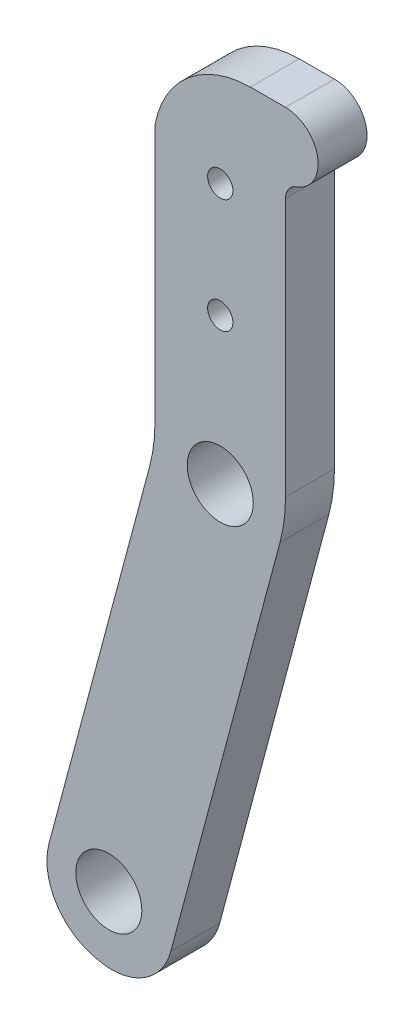
ISO-10303-21;
HEADER;
FILE_DESCRIPTION(('STEP AP214'),'2;1');
FILE_NAME('part.step','',(''),(''),'','','');
FILE_SCHEMA(('AUTOMOTIVE_DESIGN { 1 0 10303 214 1 1 1 1 }'));
ENDSEC;
DATA;
#1=APPLICATION_CONTEXT('core data for automotive mechanical design processes');
#2=APPLICATION_PROTOCOL_DEFINITION('international standard','automotive_design',2000,#1);
#3=PRODUCT_CONTEXT('',#1,'mechanical');
#4=PRODUCT('Part','Part','',(#3));
#5=PRODUCT_RELATED_PRODUCT_CATEGORY('part','',(#4));
#6=PRODUCT_DEFINITION_FORMATION('','',#4);
#7=PRODUCT_DEFINITION_CONTEXT('part definition',#1,'design');
#8=PRODUCT_DEFINITION('design','',#6,#7);
#9=PRODUCT_DEFINITION_SHAPE('','',#8);
#10=(LENGTH_UNIT() NAMED_UNIT(*) SI_UNIT(.MILLI.,.METRE.));
#11=(NAMED_UNIT(*) PLANE_ANGLE_UNIT() SI_UNIT($,.RADIAN.));
#12=(NAMED_UNIT(*) SI_UNIT($,.STERADIAN.) SOLID_ANGLE_UNIT());
#13=UNCERTAINTY_MEASURE_WITH_UNIT(LENGTH_MEASURE(1.E-05),#10,'distance_accuracy_value','');
#14=(GEOMETRIC_REPRESENTATION_CONTEXT(3) GLOBAL_UNCERTAINTY_ASSIGNED_CONTEXT((#13)) GLOBAL_UNIT_ASSIGNED_CONTEXT((#10,
#11,#12)) REPRESENTATION_CONTEXT('',''));
#15=CARTESIAN_POINT('',(0.,0.,0.));
#16=DIRECTION('',(0.,0.,1.));
#17=DIRECTION('',(1.,0.,0.));
#18=AXIS2_PLACEMENT_3D('',#15,#16,#17);
#19=CARTESIAN_POINT('',(167.434880274016,-20.2827594314005,6.));
#20=DIRECTION('',(0.258064516129032,0.966127685927222,0.));
#21=DIRECTION('',(-0.966127685927222,0.258064516129032,0.));
#22=AXIS2_PLACEMENT_3D('',#19,#20,#21);
#23=PLANE('',#22);
#24=DIRECTION('',(0.,0.,1.));
#25=VECTOR('',#24,1.);
#26=CARTESIAN_POINT('',(160.188922629561,-18.3472755604328,0.));
#27=LINE('',#26,#25);
#28=CARTESIAN_POINT('',(160.188922629561,-18.3472755604328,0.));
#29=VERTEX_POINT('',#28);
#30=CARTESIAN_POINT('',(160.188922629561,-18.3472755604328,6.));
#31=VERTEX_POINT('',#30);
#32=EDGE_CURVE('E52',#29,#31,#27,.T.);
#33=ORIENTED_EDGE('',*,*,#32,.T.);
#34=DIRECTION('',(0.966127685927222,-0.258064516129032,0.));
#35=VECTOR('',#34,1.);
#36=CARTESIAN_POINT('',(167.434880274016,-20.2827594314005,6.));
#37=LINE('',#36,#35);
#38=CARTESIAN_POINT('',(159.746394630228,-18.2290709217655,6.));
#39=VERTEX_POINT('',#38);
#40=EDGE_CURVE('E226',#39,#31,#37,.T.);
#41=ORIENTED_EDGE('',*,*,#40,.F.);
#42=DIRECTION('',(0.,0.,1.));
#43=VECTOR('',#42,1.);
#44=CARTESIAN_POINT('',(159.746394630228,-18.2290709217655,0.));
#45=LINE('',#44,#43);
#46=CARTESIAN_POINT('',(159.746394630228,-18.2290709217655,0.));
#47=VERTEX_POINT('',#46);
#48=EDGE_CURVE('E249',#47,#39,#45,.T.);
#49=ORIENTED_EDGE('',*,*,#48,.F.);
#50=DIRECTION('',(0.966127685927222,-0.258064516129032,0.));
#51=VECTOR('',#50,1.);
#52=CARTESIAN_POINT('',(167.434880274016,-20.2827594314005,0.));
#53=LINE('',#52,#51);
#54=EDGE_CURVE('E154',#47,#29,#53,.T.);
#55=ORIENTED_EDGE('',*,*,#54,.T.);
#56=EDGE_LOOP('',(#33,#41,#49,#55));
#57=FACE_BOUND('',#56,.T.);
#58=ADVANCED_FACE('F35',(#57),#23,.F.);
#59=CARTESIAN_POINT('',(166.75743399256,37.0809711141468,6.));
#60=DIRECTION('',(0.966127685927222,-0.258064516129032,0.));
#61=DIRECTION('',(0.258064516129032,0.966127685927222,0.));
#62=AXIS2_PLACEMENT_3D('',#59,#60,#61);
#63=PLANE('',#62);
#64=DIRECTION('',(0.,0.,1.));
#65=VECTOR('',#64,1.);
#66=CARTESIAN_POINT('',(154.435920856742,-9.04762940634365,0.));
#67=LINE('',#66,#65);
#68=CARTESIAN_POINT('',(154.435920856742,-9.04762940634366,0.));
#69=VERTEX_POINT('',#68);
#70=CARTESIAN_POINT('',(154.435920856742,-9.04762940634365,6.));
#71=VERTEX_POINT('',#70);
#72=EDGE_CURVE('E60',#69,#71,#67,.T.);
#73=ORIENTED_EDGE('',*,*,#72,.T.);
#74=DIRECTION('',(-0.258064516129032,-0.966127685927222,0.));
#75=VECTOR('',#74,1.);
#76=CARTESIAN_POINT('',(166.75743399256,37.0809711141468,6.));
#77=LINE('',#76,#75);
#78=CARTESIAN_POINT('',(166.75743399256,37.0809711141468,6.));
#79=VERTEX_POINT('',#78);
#80=EDGE_CURVE('E223',#79,#71,#77,.T.);
#81=ORIENTED_EDGE('',*,*,#80,.F.);
#82=DIRECTION('',(0.,0.,-1.));
#83=VECTOR('',#82,1.);
#84=CARTESIAN_POINT('',(166.75743399256,37.0809711141468,6.));
#85=LINE('',#84,#83);
#86=CARTESIAN_POINT('',(166.75743399256,37.0809711141468,0.));
#87=VERTEX_POINT('',#86);
#88=EDGE_CURVE('E11',#79,#87,#85,.T.);
#89=ORIENTED_EDGE('',*,*,#88,.T.);
#90=DIRECTION('',(-0.258064516129032,-0.966127685927222,0.));
#91=VECTOR('',#90,1.);
#92=CARTESIAN_POINT('',(166.75743399256,37.0809711141468,0.));
#93=LINE('',#92,#91);
#94=EDGE_CURVE('E158',#87,#69,#93,.T.);
#95=ORIENTED_EDGE('',*,*,#94,.T.);
#96=EDGE_LOOP('',(#73,#81,#89,#95));
#97=FACE_BOUND('',#96,.T.);
#98=ADVANCED_FACE('F242',(#97),#63,.F.);
#99=CARTESIAN_POINT('',(183.434880274016,83.6171570961765,6.));
#100=DIRECTION('',(-1.,0.,0.));
#101=DIRECTION('',(0.,0.,1.));
#102=AXIS2_PLACEMENT_3D('',#99,#100,#101);
#103=PLANE('',#102);
#104=DIRECTION('',(0.,0.,1.));
#105=VECTOR('',#104,1.);
#106=CARTESIAN_POINT('',(183.434880274015,73.9603028466835,0.));
#107=LINE('',#106,#105);
#108=CARTESIAN_POINT('',(183.434880274015,73.9603028466835,0.));
#109=VERTEX_POINT('',#108);
#110=CARTESIAN_POINT('',(183.434880274015,73.9603028466835,6.));
#111=VERTEX_POINT('',#110);
#112=EDGE_CURVE('E258',#109,#111,#107,.T.);
#113=ORIENTED_EDGE('',*,*,#112,.T.);
#114=DIRECTION('',(0.,1.,0.));
#115=VECTOR('',#114,1.);
#116=CARTESIAN_POINT('',(183.434880274016,83.6171570961765,6.));
#117=LINE('',#116,#115);
#118=CARTESIAN_POINT('',(183.434880274016,42.2422614367276,6.));
#119=VERTEX_POINT('',#118);
#120=EDGE_CURVE('E232',#119,#111,#117,.T.);
#121=ORIENTED_EDGE('',*,*,#120,.F.);
#122=DIRECTION('',(0.,0.,-1.));
#123=VECTOR('',#122,1.);
#124=CARTESIAN_POINT('',(183.434880274016,42.2422614367276,6.));
#125=LINE('',#124,#123);
#126=CARTESIAN_POINT('',(183.434880274016,42.2422614367276,0.));
#127=VERTEX_POINT('',#126);
#128=EDGE_CURVE('E177',#119,#127,#125,.T.);
#129=ORIENTED_EDGE('',*,*,#128,.T.);
#130=DIRECTION('',(0.,1.,0.));
#131=VECTOR('',#130,1.);
#132=CARTESIAN_POINT('',(183.434880274016,83.6171570961765,0.));
#133=LINE('',#132,#131);
#134=EDGE_CURVE('E156',#127,#109,#133,.T.);
#135=ORIENTED_EDGE('',*,*,#134,.T.);
#136=EDGE_LOOP('',(#113,#121,#129,#135));
#137=FACE_BOUND('',#136,.T.);
#138=ADVANCED_FACE('F265',(#137),#103,.F.);
#139=CARTESIAN_POINT('',(147.434880274016,42.2422614367275,6.));
#140=DIRECTION('',(0.,0.,-1.));
#141=DIRECTION('',(-1.,0.,0.));
#142=AXIS2_PLACEMENT_3D('',#139,#140,#141);
#143=CYLINDRICAL_SURFACE('',#142,20.);
#144=CARTESIAN_POINT('',(147.434880274016,42.2422614367275,0.));
#145=DIRECTION('',(0.,0.,-1.));
#146=DIRECTION('',(1.,0.,0.));
#147=AXIS2_PLACEMENT_3D('',#144,#145,#146);
#148=CIRCLE('',#147,20.);
#149=CARTESIAN_POINT('',(167.434880274016,42.2422614367276,0.));
#150=VERTEX_POINT('',#149);
#151=EDGE_CURVE('E218',#150,#87,#148,.T.);
#152=ORIENTED_EDGE('',*,*,#151,.T.);
#153=ORIENTED_EDGE('',*,*,#88,.F.);
#154=CARTESIAN_POINT('',(147.434880274016,42.2422614367275,6.));
#155=DIRECTION('',(0.,0.,-1.));
#156=DIRECTION('',(1.,0.,0.));
#157=AXIS2_PLACEMENT_3D('',#154,#155,#156);
#158=CIRCLE('',#157,20.);
#159=CARTESIAN_POINT('',(167.434880274016,42.2422614367276,6.));
#160=VERTEX_POINT('',#159);
#161=EDGE_CURVE('E169',#160,#79,#158,.T.);
#162=ORIENTED_EDGE('',*,*,#161,.F.);
#163=DIRECTION('',(0.,0.,-1.));
#164=VECTOR('',#163,1.);
#165=CARTESIAN_POINT('',(167.434880274016,42.2422614367276,6.));
#166=LINE('',#165,#164);
#167=EDGE_CURVE('E170',#160,#150,#166,.T.);
#168=ORIENTED_EDGE('',*,*,#167,.T.);
#169=EDGE_LOOP('',(#152,#153,#162,#168));
#170=FACE_BOUND('',#169,.T.);
#171=ADVANCED_FACE('F37',(#170),#143,.F.);
#172=CARTESIAN_POINT('',(182.75743399256,37.0809711141468,6.));
#173=DIRECTION('',(-0.966127685927222,0.258064516129032,0.));
#174=DIRECTION('',(-0.258064516129032,-0.966127685927222,0.));
#175=AXIS2_PLACEMENT_3D('',#172,#173,#174);
#176=PLANE('',#175);
#177=DIRECTION('',(0.258064516129032,0.966127685927222,0.));
#178=VECTOR('',#177,1.);
#179=CARTESIAN_POINT('',(182.75743399256,37.0809711141468,6.));
#180=LINE('',#179,#178);
#181=CARTESIAN_POINT('',(169.370364144983,-13.0368017869464,6.));
#182=VERTEX_POINT('',#181);
#183=CARTESIAN_POINT('',(182.75743399256,37.0809711141468,6.));
#184=VERTEX_POINT('',#183);
#185=EDGE_CURVE('E146',#182,#184,#180,.T.);
#186=ORIENTED_EDGE('',*,*,#185,.F.);
#187=DIRECTION('',(0.,0.,1.));
#188=VECTOR('',#187,1.);
#189=CARTESIAN_POINT('',(169.370364144983,-13.0368017869464,0.));
#190=LINE('',#189,#188);
#191=CARTESIAN_POINT('',(169.370364144983,-13.0368017869464,0.));
#192=VERTEX_POINT('',#191);
#193=EDGE_CURVE('E132',#192,#182,#190,.T.);
#194=ORIENTED_EDGE('',*,*,#193,.F.);
#195=DIRECTION('',(0.258064516129032,0.966127685927222,0.));
#196=VECTOR('',#195,1.);
#197=CARTESIAN_POINT('',(182.75743399256,37.0809711141468,0.));
#198=LINE('',#197,#196);
#199=CARTESIAN_POINT('',(182.75743399256,37.0809711141468,0.));
#200=VERTEX_POINT('',#199);
#201=EDGE_CURVE('E144',#192,#200,#198,.T.);
#202=ORIENTED_EDGE('',*,*,#201,.T.);
#203=DIRECTION('',(0.,0.,-1.));
#204=VECTOR('',#203,1.);
#205=CARTESIAN_POINT('',(182.75743399256,37.0809711141468,6.));
#206=LINE('',#205,#204);
#207=EDGE_CURVE('E44',#184,#200,#206,.T.);
#208=ORIENTED_EDGE('',*,*,#207,.F.);
#209=EDGE_LOOP('',(#186,#194,#202,#208));
#210=FACE_BOUND('',#209,.T.);
#211=ADVANCED_FACE('F142',(#210),#176,.F.);
#212=CARTESIAN_POINT('',(163.434880274016,42.2422614367275,6.));
#213=DIRECTION('',(0.,0.,-1.));
#214=DIRECTION('',(-1.,0.,0.));
#215=AXIS2_PLACEMENT_3D('',#212,#213,#214);
#216=CYLINDRICAL_SURFACE('',#215,20.);
#217=CARTESIAN_POINT('',(163.434880274016,42.2422614367275,0.));
#218=DIRECTION('',(0.,0.,1.));
#219=DIRECTION('',(-1.,0.,0.));
#220=AXIS2_PLACEMENT_3D('',#217,#218,#219);
#221=CIRCLE('',#220,20.);
#222=EDGE_CURVE('E153',#200,#127,#221,.T.);
#223=ORIENTED_EDGE('',*,*,#222,.T.);
#224=ORIENTED_EDGE('',*,*,#128,.F.);
#225=CARTESIAN_POINT('',(163.434880274016,42.2422614367275,6.));
#226=DIRECTION('',(0.,0.,1.));
#227=DIRECTION('',(-1.,0.,0.));
#228=AXIS2_PLACEMENT_3D('',#225,#226,#227);
#229=CIRCLE('',#228,20.);
#230=EDGE_CURVE('E230',#184,#119,#229,.T.);
#231=ORIENTED_EDGE('',*,*,#230,.F.);
#232=ORIENTED_EDGE('',*,*,#207,.T.);
#233=EDGE_LOOP('',(#223,#224,#231,#232));
#234=FACE_BOUND('',#233,.T.);
#235=ADVANCED_FACE('F274',(#234),#216,.T.);
#236=CARTESIAN_POINT('',(183.434880274016,83.6171570961765,6.));
#237=DIRECTION('',(0.,-1.,0.));
#238=DIRECTION('',(0.,0.,-1.));
#239=AXIS2_PLACEMENT_3D('',#236,#237,#238);
#240=PLANE('',#239);
#241=DIRECTION('',(-1.,0.,0.));
#242=VECTOR('',#241,1.);
#243=CARTESIAN_POINT('',(183.434880274016,83.6171570961765,0.));
#244=LINE('',#243,#242);
#245=CARTESIAN_POINT('',(183.434880274016,83.6171570961765,0.));
#246=VERTEX_POINT('',#245);
#247=CARTESIAN_POINT('',(179.126801066159,83.6171570961765,0.));
#248=VERTEX_POINT('',#247);
#249=EDGE_CURVE('E164',#246,#248,#244,.T.);
#250=ORIENTED_EDGE('',*,*,#249,.T.);
#251=DIRECTION('',(0.,0.,1.));
#252=VECTOR('',#251,1.);
#253=CARTESIAN_POINT('',(179.126801066159,83.6171570961765,0.));
#254=LINE('',#253,#252);
#255=CARTESIAN_POINT('',(179.126801066159,83.6171570961765,6.));
#256=VERTEX_POINT('',#255);
#257=EDGE_CURVE('E202',#248,#256,#254,.T.);
#258=ORIENTED_EDGE('',*,*,#257,.T.);
#259=DIRECTION('',(-1.,0.,0.));
#260=VECTOR('',#259,1.);
#261=CARTESIAN_POINT('',(183.434880274016,83.6171570961765,6.));
#262=LINE('',#261,#260);
#263=CARTESIAN_POINT('',(183.434880274016,83.6171570961765,6.));
#264=VERTEX_POINT('',#263);
#265=EDGE_CURVE('E235',#264,#256,#262,.T.);
#266=ORIENTED_EDGE('',*,*,#265,.F.);
#267=DIRECTION('',(0.,0.,-1.));
#268=VECTOR('',#267,1.);
#269=CARTESIAN_POINT('',(183.434880274016,83.6171570961765,6.));
#270=LINE('',#269,#268);
#271=EDGE_CURVE('E173',#264,#246,#270,.T.);
#272=ORIENTED_EDGE('',*,*,#271,.T.);
#273=EDGE_LOOP('',(#250,#258,#266,#272));
#274=FACE_BOUND('',#273,.T.);
#275=ADVANCED_FACE('F287',(#274),#240,.F.);
#276=CARTESIAN_POINT('',(167.434880274016,83.6171570961765,6.));
#277=DIRECTION('',(1.,0.,0.));
#278=DIRECTION('',(0.,0.,-1.));
#279=AXIS2_PLACEMENT_3D('',#276,#277,#278);
#280=PLANE('',#279);
#281=DIRECTION('',(0.,-1.,0.));
#282=VECTOR('',#281,1.);
#283=CARTESIAN_POINT('',(167.434880274016,83.6171570961765,6.));
#284=LINE('',#283,#282);
#285=CARTESIAN_POINT('',(167.434880274016,73.7778891471937,6.));
#286=VERTEX_POINT('',#285);
#287=EDGE_CURVE('E174',#286,#160,#284,.T.);
#288=ORIENTED_EDGE('',*,*,#287,.F.);
#289=DIRECTION('',(0.,0.,1.));
#290=VECTOR('',#289,1.);
#291=CARTESIAN_POINT('',(167.434880274016,73.7778891471937,0.));
#292=LINE('',#291,#290);
#293=CARTESIAN_POINT('',(167.434880274016,73.7778891471937,0.));
#294=VERTEX_POINT('',#293);
#295=EDGE_CURVE('E204',#294,#286,#292,.T.);
#296=ORIENTED_EDGE('',*,*,#295,.F.);
#297=DIRECTION('',(0.,-1.,0.));
#298=VECTOR('',#297,1.);
#299=CARTESIAN_POINT('',(167.434880274016,83.6171570961765,0.));
#300=LINE('',#299,#298);
#301=EDGE_CURVE('E167',#294,#150,#300,.T.);
#302=ORIENTED_EDGE('',*,*,#301,.T.);
#303=ORIENTED_EDGE('',*,*,#167,.F.);
#304=EDGE_LOOP('',(#288,#296,#302,#303));
#305=FACE_BOUND('',#304,.T.);
#306=ADVANCED_FACE('F293',(#305),#280,.F.);
#307=CARTESIAN_POINT('',(147.434880274016,42.2422614367275,6.));
#308=DIRECTION('',(0.,0.,1.));
#309=DIRECTION('',(1.,0.,0.));
#310=AXIS2_PLACEMENT_3D('',#307,#308,#309);
#311=PLANE('',#310);
#312=CARTESIAN_POINT('',(162.124406500529,-11.1013179159786,6.));
#313=DIRECTION('',(0.,0.,-1.));
#314=DIRECTION('',(1.,0.,0.));
#315=AXIS2_PLACEMENT_3D('',#312,#313,#314);
#316=CIRCLE('',#315,7.5);
#317=EDGE_CURVE('E138',#182,#31,#316,.T.);
#318=ORIENTED_EDGE('',*,*,#317,.F.);
#319=ORIENTED_EDGE('',*,*,#185,.T.);
#320=ORIENTED_EDGE('',*,*,#230,.T.);
#321=ORIENTED_EDGE('',*,*,#120,.T.);
#322=CARTESIAN_POINT('',(185.434880274016,73.9603028466822,6.));
#323=DIRECTION('',(0.,0.,-1.));
#324=DIRECTION('',(-1.,0.,0.));
#325=AXIS2_PLACEMENT_3D('',#322,#323,#324);
#326=CIRCLE('',#325,2.00000000000059);
#327=CARTESIAN_POINT('',(184.768213607347,75.8459209298475,6.));
#328=VERTEX_POINT('',#327);
#329=EDGE_CURVE('E254',#111,#328,#326,.T.);
#330=ORIENTED_EDGE('',*,*,#329,.T.);
#331=CARTESIAN_POINT('',(183.434880274016,79.6171570961765,6.));
#332=DIRECTION('',(0.,0.,1.));
#333=DIRECTION('',(1.,0.,0.));
#334=AXIS2_PLACEMENT_3D('',#331,#332,#333);
#335=CIRCLE('',#334,4.);
#336=EDGE_CURVE('E182',#328,#264,#335,.T.);
#337=ORIENTED_EDGE('',*,*,#336,.T.);
#338=ORIENTED_EDGE('',*,*,#265,.T.);
#339=CARTESIAN_POINT('',(179.238841350269,71.6176801502951,6.));
#340=DIRECTION('',(0.,0.,-1.));
#341=DIRECTION('',(1.,0.,0.));
#342=AXIS2_PLACEMENT_3D('',#339,#340,#341);
#343=CIRCLE('',#342,12.);
#344=EDGE_CURVE('E197',#286,#256,#343,.T.);
#345=ORIENTED_EDGE('',*,*,#344,.F.);
#346=ORIENTED_EDGE('',*,*,#287,.T.);
#347=ORIENTED_EDGE('',*,*,#161,.T.);
#348=ORIENTED_EDGE('',*,*,#80,.T.);
#349=CARTESIAN_POINT('',(161.681878501196,-10.9831132773114,6.));
#350=DIRECTION('',(0.,0.,-1.));
#351=DIRECTION('',(1.,0.,0.));
#352=AXIS2_PLACEMENT_3D('',#349,#350,#351);
#353=CIRCLE('',#352,7.5);
#354=EDGE_CURVE('E147',#39,#71,#353,.T.);
#355=ORIENTED_EDGE('',*,*,#354,.F.);
#356=ORIENTED_EDGE('',*,*,#40,.T.);
#357=EDGE_LOOP('',(#318,#319,#320,#321,#330,#337,#338,#345,#346,#347,#348,#355,#356));
#358=FACE_BOUND('',#357,.T.);
#359=CARTESIAN_POINT('',(175.434880274009,71.5307705710504,6.));
#360=DIRECTION('',(0.,0.,1.));
#361=DIRECTION('',(1.,0.,0.));
#362=AXIS2_PLACEMENT_3D('',#359,#360,#361);
#363=CIRCLE('',#362,1.55000000001295);
#364=CARTESIAN_POINT('',(176.984880274022,71.5307705710504,6.));
#365=VERTEX_POINT('',#364);
#366=EDGE_CURVE('E193',#365,#365,#363,.T.);
#367=ORIENTED_EDGE('',*,*,#366,.F.);
#368=EDGE_LOOP('',(#367));
#369=FACE_BOUND('',#368,.T.);
#370=CARTESIAN_POINT('',(175.434880274008,57.5307705710504,6.));
#371=DIRECTION('',(0.,0.,1.));
#372=DIRECTION('',(1.,0.,0.));
#373=AXIS2_PLACEMENT_3D('',#370,#371,#372);
#374=CIRCLE('',#373,1.5500000000099);
#375=CARTESIAN_POINT('',(176.984880274018,57.5307705710504,6.));
#376=VERTEX_POINT('',#375);
#377=EDGE_CURVE('E183',#376,#376,#374,.T.);
#378=ORIENTED_EDGE('',*,*,#377,.F.);
#379=EDGE_LOOP('',(#378));
#380=FACE_BOUND('',#379,.T.);
#381=CARTESIAN_POINT('',(161.77037491563,-10.4892218149505,6.));
#382=DIRECTION('',(0.,0.,1.));
#383=DIRECTION('',(1.,0.,0.));
#384=AXIS2_PLACEMENT_3D('',#381,#382,#383);
#385=CIRCLE('',#384,4.04999999999999);
#386=CARTESIAN_POINT('',(165.82037491563,-10.4892218149505,6.));
#387=VERTEX_POINT('',#386);
#388=EDGE_CURVE('E206',#387,#387,#385,.T.);
#389=ORIENTED_EDGE('',*,*,#388,.F.);
#390=EDGE_LOOP('',(#389));
#391=FACE_BOUND('',#390,.T.);
#392=CARTESIAN_POINT('',(175.434880274016,39.6171570961765,6.));
#393=DIRECTION('',(0.,0.,1.));
#394=DIRECTION('',(1.,0.,0.));
#395=AXIS2_PLACEMENT_3D('',#392,#393,#394);
#396=CIRCLE('',#395,4.04999999999999);
#397=CARTESIAN_POINT('',(179.484880274016,39.6171570961765,6.));
#398=VERTEX_POINT('',#397);
#399=EDGE_CURVE('E212',#398,#398,#396,.T.);
#400=ORIENTED_EDGE('',*,*,#399,.F.);
#401=EDGE_LOOP('',(#400));
#402=FACE_BOUND('',#401,.T.);
#403=ADVANCED_FACE('F269',(#358,#369,#380,#391,#402),#311,.T.);
#404=CARTESIAN_POINT('',(147.434880274016,42.2422614367275,0.));
#405=DIRECTION('',(0.,0.,1.));
#406=DIRECTION('',(1.,0.,0.));
#407=AXIS2_PLACEMENT_3D('',#404,#405,#406);
#408=PLANE('',#407);
#409=ORIENTED_EDGE('',*,*,#201,.F.);
#410=CARTESIAN_POINT('',(162.124406500529,-11.1013179159786,0.));
#411=DIRECTION('',(0.,0.,-1.));
#412=DIRECTION('',(1.,0.,0.));
#413=AXIS2_PLACEMENT_3D('',#410,#411,#412);
#414=CIRCLE('',#413,7.5);
#415=EDGE_CURVE('E129',#192,#29,#414,.T.);
#416=ORIENTED_EDGE('',*,*,#415,.T.);
#417=ORIENTED_EDGE('',*,*,#54,.F.);
#418=CARTESIAN_POINT('',(161.681878501196,-10.9831132773114,0.));
#419=DIRECTION('',(0.,0.,-1.));
#420=DIRECTION('',(1.,0.,0.));
#421=AXIS2_PLACEMENT_3D('',#418,#419,#420);
#422=CIRCLE('',#421,7.5);
#423=EDGE_CURVE('E246',#47,#69,#422,.T.);
#424=ORIENTED_EDGE('',*,*,#423,.T.);
#425=ORIENTED_EDGE('',*,*,#94,.F.);
#426=ORIENTED_EDGE('',*,*,#151,.F.);
#427=ORIENTED_EDGE('',*,*,#301,.F.);
#428=CARTESIAN_POINT('',(179.238841350269,71.6176801502951,0.));
#429=DIRECTION('',(0.,0.,-1.));
#430=DIRECTION('',(1.,0.,0.));
#431=AXIS2_PLACEMENT_3D('',#428,#429,#430);
#432=CIRCLE('',#431,12.);
#433=EDGE_CURVE('E199',#294,#248,#432,.T.);
#434=ORIENTED_EDGE('',*,*,#433,.T.);
#435=ORIENTED_EDGE('',*,*,#249,.F.);
#436=CARTESIAN_POINT('',(183.434880274016,79.6171570961765,0.));
#437=DIRECTION('',(0.,0.,1.));
#438=DIRECTION('',(1.,0.,0.));
#439=AXIS2_PLACEMENT_3D('',#436,#437,#438);
#440=CIRCLE('',#439,4.);
#441=CARTESIAN_POINT('',(184.768213607348,75.8459209298474,0.));
#442=VERTEX_POINT('',#441);
#443=EDGE_CURVE('E186',#442,#246,#440,.T.);
#444=ORIENTED_EDGE('',*,*,#443,.F.);
#445=CARTESIAN_POINT('',(185.434880274016,73.9603028466822,0.));
#446=DIRECTION('',(0.,0.,-1.));
#447=DIRECTION('',(-1.,0.,0.));
#448=AXIS2_PLACEMENT_3D('',#445,#446,#447);
#449=CIRCLE('',#448,2.00000000000059);
#450=EDGE_CURVE('E256',#109,#442,#449,.T.);
#451=ORIENTED_EDGE('',*,*,#450,.F.);
#452=ORIENTED_EDGE('',*,*,#134,.F.);
#453=ORIENTED_EDGE('',*,*,#222,.F.);
#454=EDGE_LOOP('',(#409,#416,#417,#424,#425,#426,#427,#434,#435,#444,#451,#452,#453));
#455=FACE_BOUND('',#454,.T.);
#456=CARTESIAN_POINT('',(175.434880274009,71.5307705710504,0.));
#457=DIRECTION('',(0.,0.,1.));
#458=DIRECTION('',(1.,0.,0.));
#459=AXIS2_PLACEMENT_3D('',#456,#457,#458);
#460=CIRCLE('',#459,1.55000000001295);
#461=CARTESIAN_POINT('',(176.984880274022,71.5307705710504,0.));
#462=VERTEX_POINT('',#461);
#463=EDGE_CURVE('E39',#462,#462,#460,.T.);
#464=ORIENTED_EDGE('',*,*,#463,.T.);
#465=EDGE_LOOP('',(#464));
#466=FACE_BOUND('',#465,.T.);
#467=CARTESIAN_POINT('',(175.434880274008,57.5307705710504,0.));
#468=DIRECTION('',(0.,0.,1.));
#469=DIRECTION('',(1.,0.,0.));
#470=AXIS2_PLACEMENT_3D('',#467,#468,#469);
#471=CIRCLE('',#470,1.5500000000099);
#472=CARTESIAN_POINT('',(176.984880274018,57.5307705710504,0.));
#473=VERTEX_POINT('',#472);
#474=EDGE_CURVE('E180',#473,#473,#471,.T.);
#475=ORIENTED_EDGE('',*,*,#474,.T.);
#476=EDGE_LOOP('',(#475));
#477=FACE_BOUND('',#476,.T.);
#478=CARTESIAN_POINT('',(161.77037491563,-10.4892218149505,0.));
#479=DIRECTION('',(0.,0.,1.));
#480=DIRECTION('',(1.,0.,0.));
#481=AXIS2_PLACEMENT_3D('',#478,#479,#480);
#482=CIRCLE('',#481,4.04999999999999);
#483=CARTESIAN_POINT('',(165.82037491563,-10.4892218149505,0.));
#484=VERTEX_POINT('',#483);
#485=EDGE_CURVE('E209',#484,#484,#482,.T.);
#486=ORIENTED_EDGE('',*,*,#485,.T.);
#487=EDGE_LOOP('',(#486));
#488=FACE_BOUND('',#487,.T.);
#489=CARTESIAN_POINT('',(175.434880274016,39.6171570961765,0.));
#490=DIRECTION('',(0.,0.,1.));
#491=DIRECTION('',(1.,0.,0.));
#492=AXIS2_PLACEMENT_3D('',#489,#490,#491);
#493=CIRCLE('',#492,4.04999999999999);
#494=CARTESIAN_POINT('',(179.484880274016,39.6171570961765,0.));
#495=VERTEX_POINT('',#494);
#496=EDGE_CURVE('E215',#495,#495,#493,.T.);
#497=ORIENTED_EDGE('',*,*,#496,.T.);
#498=EDGE_LOOP('',(#497));
#499=FACE_BOUND('',#498,.T.);
#500=ADVANCED_FACE('F150',(#455,#466,#477,#488,#499),#408,.F.);
#501=CARTESIAN_POINT('',(175.434880274016,39.6171570961765,0.));
#502=DIRECTION('',(0.,0.,1.));
#503=DIRECTION('',(1.,0.,0.));
#504=AXIS2_PLACEMENT_3D('',#501,#502,#503);
#505=CYLINDRICAL_SURFACE('',#504,4.04999999999999);
#506=ORIENTED_EDGE('',*,*,#496,.F.);
#507=EDGE_LOOP('',(#506));
#508=FACE_BOUND('',#507,.T.);
#509=ORIENTED_EDGE('',*,*,#399,.T.);
#510=EDGE_LOOP('',(#509));
#511=FACE_BOUND('',#510,.T.);
#512=ADVANCED_FACE('F327',(#508,#511),#505,.F.);
#513=CARTESIAN_POINT('',(161.77037491563,-10.4892218149505,0.));
#514=DIRECTION('',(0.,0.,1.));
#515=DIRECTION('',(1.,0.,0.));
#516=AXIS2_PLACEMENT_3D('',#513,#514,#515);
#517=CYLINDRICAL_SURFACE('',#516,4.04999999999999);
#518=ORIENTED_EDGE('',*,*,#485,.F.);
#519=EDGE_LOOP('',(#518));
#520=FACE_BOUND('',#519,.T.);
#521=ORIENTED_EDGE('',*,*,#388,.T.);
#522=EDGE_LOOP('',(#521));
#523=FACE_BOUND('',#522,.T.);
#524=ADVANCED_FACE('F332',(#520,#523),#517,.F.);
#525=CARTESIAN_POINT('',(179.238841350269,71.6176801502951,0.));
#526=DIRECTION('',(0.,0.,1.));
#527=DIRECTION('',(1.,0.,0.));
#528=AXIS2_PLACEMENT_3D('',#525,#526,#527);
#529=CYLINDRICAL_SURFACE('',#528,12.);
#530=ORIENTED_EDGE('',*,*,#344,.T.);
#531=ORIENTED_EDGE('',*,*,#257,.F.);
#532=ORIENTED_EDGE('',*,*,#433,.F.);
#533=ORIENTED_EDGE('',*,*,#295,.T.);
#534=EDGE_LOOP('',(#530,#531,#532,#533));
#535=FACE_BOUND('',#534,.T.);
#536=ADVANCED_FACE('F289',(#535),#529,.T.);
#537=CARTESIAN_POINT('',(183.434880274016,79.6171570961765,0.));
#538=DIRECTION('',(0.,0.,1.));
#539=DIRECTION('',(1.,0.,0.));
#540=AXIS2_PLACEMENT_3D('',#537,#538,#539);
#541=CYLINDRICAL_SURFACE('',#540,4.);
#542=DIRECTION('',(0.,0.,1.));
#543=VECTOR('',#542,1.);
#544=CARTESIAN_POINT('',(184.768213607348,75.8459209298474,0.));
#545=LINE('',#544,#543);
#546=EDGE_CURVE('E260',#442,#328,#545,.T.);
#547=ORIENTED_EDGE('',*,*,#546,.F.);
#548=ORIENTED_EDGE('',*,*,#443,.T.);
#549=ORIENTED_EDGE('',*,*,#271,.F.);
#550=ORIENTED_EDGE('',*,*,#336,.F.);
#551=EDGE_LOOP('',(#547,#548,#549,#550));
#552=FACE_BOUND('',#551,.T.);
#553=ADVANCED_FACE('F281',(#552),#541,.T.);
#554=CARTESIAN_POINT('',(175.434880274008,57.5307705710504,-4.));
#555=DIRECTION('',(0.,0.,1.));
#556=DIRECTION('',(1.,0.,0.));
#557=AXIS2_PLACEMENT_3D('',#554,#555,#556);
#558=CYLINDRICAL_SURFACE('',#557,1.5500000000099);
#559=ORIENTED_EDGE('',*,*,#377,.T.);
#560=EDGE_LOOP('',(#559));
#561=FACE_BOUND('',#560,.T.);
#562=ORIENTED_EDGE('',*,*,#474,.F.);
#563=EDGE_LOOP('',(#562));
#564=FACE_BOUND('',#563,.T.);
#565=ADVANCED_FACE('F341',(#561,#564),#558,.F.);
#566=CARTESIAN_POINT('',(175.434880274009,71.5307705710504,-4.));
#567=DIRECTION('',(0.,0.,1.));
#568=DIRECTION('',(1.,0.,0.));
#569=AXIS2_PLACEMENT_3D('',#566,#567,#568);
#570=CYLINDRICAL_SURFACE('',#569,1.55000000001295);
#571=ORIENTED_EDGE('',*,*,#366,.T.);
#572=EDGE_LOOP('',(#571));
#573=FACE_BOUND('',#572,.T.);
#574=ORIENTED_EDGE('',*,*,#463,.F.);
#575=EDGE_LOOP('',(#574));
#576=FACE_BOUND('',#575,.T.);
#577=ADVANCED_FACE('F307',(#573,#576),#570,.F.);
#578=CARTESIAN_POINT('',(185.434880274016,73.9603028466822,0.));
#579=DIRECTION('',(0.,0.,1.));
#580=DIRECTION('',(1.,0.,0.));
#581=AXIS2_PLACEMENT_3D('',#578,#579,#580);
#582=CYLINDRICAL_SURFACE('',#581,2.00000000000059);
#583=ORIENTED_EDGE('',*,*,#329,.F.);
#584=ORIENTED_EDGE('',*,*,#112,.F.);
#585=ORIENTED_EDGE('',*,*,#450,.T.);
#586=ORIENTED_EDGE('',*,*,#546,.T.);
#587=EDGE_LOOP('',(#583,#584,#585,#586));
#588=FACE_BOUND('',#587,.T.);
#589=ADVANCED_FACE('F278',(#588),#582,.F.);
#590=CARTESIAN_POINT('',(161.681878501196,-10.9831132773114,0.));
#591=DIRECTION('',(0.,0.,1.));
#592=DIRECTION('',(1.,0.,0.));
#593=AXIS2_PLACEMENT_3D('',#590,#591,#592);
#594=CYLINDRICAL_SURFACE('',#593,7.5);
#595=ORIENTED_EDGE('',*,*,#354,.T.);
#596=ORIENTED_EDGE('',*,*,#72,.F.);
#597=ORIENTED_EDGE('',*,*,#423,.F.);
#598=ORIENTED_EDGE('',*,*,#48,.T.);
#599=EDGE_LOOP('',(#595,#596,#597,#598));
#600=FACE_BOUND('',#599,.T.);
#601=ADVANCED_FACE('F299',(#600),#594,.T.);
#602=CARTESIAN_POINT('',(162.124406500529,-11.1013179159786,0.));
#603=DIRECTION('',(0.,0.,1.));
#604=DIRECTION('',(1.,0.,0.));
#605=AXIS2_PLACEMENT_3D('',#602,#603,#604);
#606=CYLINDRICAL_SURFACE('',#605,7.5);
#607=ORIENTED_EDGE('',*,*,#317,.T.);
#608=ORIENTED_EDGE('',*,*,#32,.F.);
#609=ORIENTED_EDGE('',*,*,#415,.F.);
#610=ORIENTED_EDGE('',*,*,#193,.T.);
#611=EDGE_LOOP('',(#607,#608,#609,#610));
#612=FACE_BOUND('',#611,.T.);
#613=ADVANCED_FACE('F131',(#612),#606,.T.);
#614=CLOSED_SHELL('',(#58,#98,#138,#171,#211,#235,#275,#306,#403,#500,#512,#524,#536,#553,#565,
#577,#589,#601,#613));
#615=MANIFOLD_SOLID_BREP('B2',#614);
#616=ADVANCED_BREP_SHAPE_REPRESENTATION('',(#18,#615),#14);
#617=SHAPE_DEFINITION_REPRESENTATION(#9,#616);
ENDSEC;
END-ISO-10303-21;
